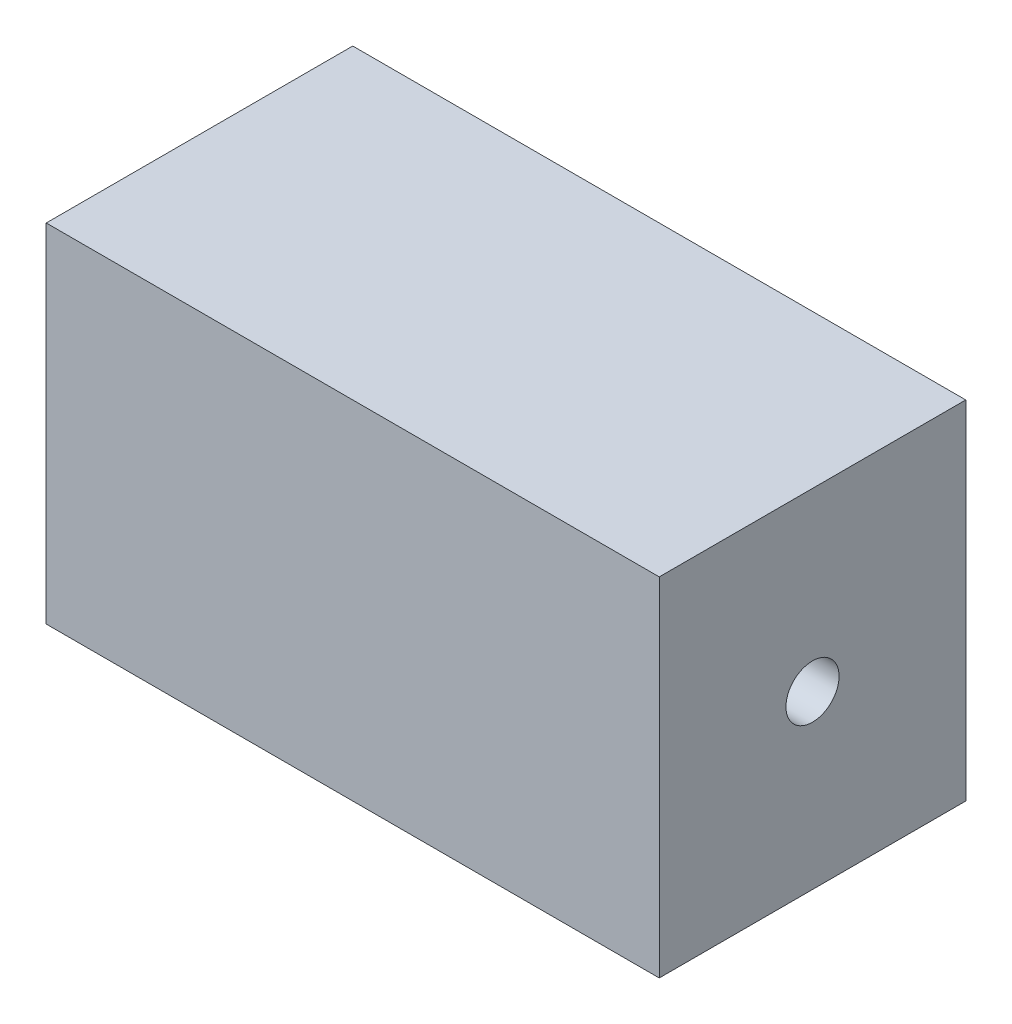
ISO-10303-21;
HEADER;
FILE_DESCRIPTION(('STEP AP214'),'2;1');
FILE_NAME('part.step','',(''),(''),'','','');
FILE_SCHEMA(('AUTOMOTIVE_DESIGN { 1 0 10303 214 1 1 1 1 }'));
ENDSEC;
DATA;
#1=APPLICATION_CONTEXT('core data for automotive mechanical design processes');
#2=APPLICATION_PROTOCOL_DEFINITION('international standard','automotive_design',2000,#1);
#3=PRODUCT_CONTEXT('',#1,'mechanical');
#4=PRODUCT('Part','Part','',(#3));
#5=PRODUCT_RELATED_PRODUCT_CATEGORY('part','',(#4));
#6=PRODUCT_DEFINITION_FORMATION('','',#4);
#7=PRODUCT_DEFINITION_CONTEXT('part definition',#1,'design');
#8=PRODUCT_DEFINITION('design','',#6,#7);
#9=PRODUCT_DEFINITION_SHAPE('','',#8);
#10=(LENGTH_UNIT() NAMED_UNIT(*) SI_UNIT(.MILLI.,.METRE.));
#11=(NAMED_UNIT(*) PLANE_ANGLE_UNIT() SI_UNIT($,.RADIAN.));
#12=(NAMED_UNIT(*) SI_UNIT($,.STERADIAN.) SOLID_ANGLE_UNIT());
#13=UNCERTAINTY_MEASURE_WITH_UNIT(LENGTH_MEASURE(1.E-05),#10,'distance_accuracy_value','');
#14=(GEOMETRIC_REPRESENTATION_CONTEXT(3) GLOBAL_UNCERTAINTY_ASSIGNED_CONTEXT((#13)) GLOBAL_UNIT_ASSIGNED_CONTEXT((#10,
#11,#12)) REPRESENTATION_CONTEXT('',''));
#15=CARTESIAN_POINT('',(0.,0.,0.));
#16=DIRECTION('',(0.,0.,1.));
#17=DIRECTION('',(1.,0.,0.));
#18=AXIS2_PLACEMENT_3D('',#15,#16,#17);
#19=CARTESIAN_POINT('',(0.,107.95,-95.25));
#20=DIRECTION('',(0.,0.,-1.));
#21=DIRECTION('',(-1.,0.,0.));
#22=AXIS2_PLACEMENT_3D('',#19,#20,#21);
#23=PLANE('',#22);
#24=DIRECTION('',(1.,0.,0.));
#25=VECTOR('',#24,1.);
#26=CARTESIAN_POINT('',(0.,0.,-95.25));
#27=LINE('',#26,#25);
#28=CARTESIAN_POINT('',(0.,0.,-95.25));
#29=VERTEX_POINT('',#28);
#30=CARTESIAN_POINT('',(190.5,0.,-95.25));
#31=VERTEX_POINT('',#30);
#32=EDGE_CURVE('E102',#29,#31,#27,.T.);
#33=ORIENTED_EDGE('',*,*,#32,.F.);
#34=DIRECTION('',(0.,-1.,0.));
#35=VECTOR('',#34,1.);
#36=CARTESIAN_POINT('',(0.,107.95,-95.25));
#37=LINE('',#36,#35);
#38=CARTESIAN_POINT('',(0.,107.95,-95.25));
#39=VERTEX_POINT('',#38);
#40=EDGE_CURVE('E11',#39,#29,#37,.T.);
#41=ORIENTED_EDGE('',*,*,#40,.F.);
#42=DIRECTION('',(1.,0.,0.));
#43=VECTOR('',#42,1.);
#44=CARTESIAN_POINT('',(0.,107.95,-95.25));
#45=LINE('',#44,#43);
#46=CARTESIAN_POINT('',(190.5,107.95,-95.25));
#47=VERTEX_POINT('',#46);
#48=EDGE_CURVE('E95',#39,#47,#45,.T.);
#49=ORIENTED_EDGE('',*,*,#48,.T.);
#50=DIRECTION('',(0.,-1.,0.));
#51=VECTOR('',#50,1.);
#52=CARTESIAN_POINT('',(190.5,107.95,-95.25));
#53=LINE('',#52,#51);
#54=EDGE_CURVE('E92',#47,#31,#53,.T.);
#55=ORIENTED_EDGE('',*,*,#54,.T.);
#56=EDGE_LOOP('',(#33,#41,#49,#55));
#57=FACE_BOUND('',#56,.T.);
#58=ADVANCED_FACE('F35',(#57),#23,.T.);
#59=CARTESIAN_POINT('',(0.,107.95,0.));
#60=DIRECTION('',(-1.,0.,0.));
#61=DIRECTION('',(0.,0.,1.));
#62=AXIS2_PLACEMENT_3D('',#59,#60,#61);
#63=PLANE('',#62);
#64=DIRECTION('',(0.,0.,-1.));
#65=VECTOR('',#64,1.);
#66=CARTESIAN_POINT('',(0.,0.,0.));
#67=LINE('',#66,#65);
#68=CARTESIAN_POINT('',(0.,0.,0.));
#69=VERTEX_POINT('',#68);
#70=EDGE_CURVE('E97',#69,#29,#67,.T.);
#71=ORIENTED_EDGE('',*,*,#70,.F.);
#72=DIRECTION('',(0.,-1.,0.));
#73=VECTOR('',#72,1.);
#74=CARTESIAN_POINT('',(0.,107.95,0.));
#75=LINE('',#74,#73);
#76=CARTESIAN_POINT('',(0.,107.95,0.));
#77=VERTEX_POINT('',#76);
#78=EDGE_CURVE('E44',#77,#69,#75,.T.);
#79=ORIENTED_EDGE('',*,*,#78,.F.);
#80=DIRECTION('',(0.,0.,-1.));
#81=VECTOR('',#80,1.);
#82=CARTESIAN_POINT('',(0.,107.95,0.));
#83=LINE('',#82,#81);
#84=EDGE_CURVE('E83',#77,#39,#83,.T.);
#85=ORIENTED_EDGE('',*,*,#84,.T.);
#86=ORIENTED_EDGE('',*,*,#40,.T.);
#87=EDGE_LOOP('',(#71,#79,#85,#86));
#88=FACE_BOUND('',#87,.T.);
#89=ADVANCED_FACE('F112',(#88),#63,.T.);
#90=CARTESIAN_POINT('',(0.,107.95,0.));
#91=DIRECTION('',(0.,0.,-1.));
#92=DIRECTION('',(-1.,0.,0.));
#93=AXIS2_PLACEMENT_3D('',#90,#91,#92);
#94=PLANE('',#93);
#95=DIRECTION('',(1.,0.,0.));
#96=VECTOR('',#95,1.);
#97=CARTESIAN_POINT('',(0.,0.,0.));
#98=LINE('',#97,#96);
#99=CARTESIAN_POINT('',(190.5,0.,0.));
#100=VERTEX_POINT('',#99);
#101=EDGE_CURVE('E88',#69,#100,#98,.T.);
#102=ORIENTED_EDGE('',*,*,#101,.T.);
#103=DIRECTION('',(0.,-1.,0.));
#104=VECTOR('',#103,1.);
#105=CARTESIAN_POINT('',(190.5,107.95,0.));
#106=LINE('',#105,#104);
#107=CARTESIAN_POINT('',(190.5,107.95,0.));
#108=VERTEX_POINT('',#107);
#109=EDGE_CURVE('E86',#108,#100,#106,.T.);
#110=ORIENTED_EDGE('',*,*,#109,.F.);
#111=DIRECTION('',(1.,0.,0.));
#112=VECTOR('',#111,1.);
#113=CARTESIAN_POINT('',(0.,107.95,0.));
#114=LINE('',#113,#112);
#115=EDGE_CURVE('E80',#77,#108,#114,.T.);
#116=ORIENTED_EDGE('',*,*,#115,.F.);
#117=ORIENTED_EDGE('',*,*,#78,.T.);
#118=EDGE_LOOP('',(#102,#110,#116,#117));
#119=FACE_BOUND('',#118,.T.);
#120=ADVANCED_FACE('F87',(#119),#94,.F.);
#121=CARTESIAN_POINT('',(190.5,107.95,0.));
#122=DIRECTION('',(-1.,0.,0.));
#123=DIRECTION('',(0.,0.,1.));
#124=AXIS2_PLACEMENT_3D('',#121,#122,#123);
#125=PLANE('',#124);
#126=CARTESIAN_POINT('',(190.5,53.2868719153612,-47.625));
#127=DIRECTION('',(-1.,0.,0.));
#128=DIRECTION('',(0.,0.,1.));
#129=AXIS2_PLACEMENT_3D('',#126,#127,#128);
#130=CIRCLE('',#129,8.255);
#131=CARTESIAN_POINT('',(190.5,53.2868719153612,-39.37));
#132=VERTEX_POINT('',#131);
#133=EDGE_CURVE('E38',#132,#132,#130,.T.);
#134=ORIENTED_EDGE('',*,*,#133,.T.);
#135=EDGE_LOOP('',(#134));
#136=FACE_BOUND('',#135,.T.);
#137=DIRECTION('',(0.,0.,-1.));
#138=VECTOR('',#137,1.);
#139=CARTESIAN_POINT('',(190.5,0.,0.));
#140=LINE('',#139,#138);
#141=EDGE_CURVE('E105',#100,#31,#140,.T.);
#142=ORIENTED_EDGE('',*,*,#141,.T.);
#143=ORIENTED_EDGE('',*,*,#54,.F.);
#144=DIRECTION('',(0.,0.,-1.));
#145=VECTOR('',#144,1.);
#146=CARTESIAN_POINT('',(190.5,107.95,0.));
#147=LINE('',#146,#145);
#148=EDGE_CURVE('E77',#108,#47,#147,.T.);
#149=ORIENTED_EDGE('',*,*,#148,.F.);
#150=ORIENTED_EDGE('',*,*,#109,.T.);
#151=EDGE_LOOP('',(#142,#143,#149,#150));
#152=FACE_BOUND('',#151,.T.);
#153=ADVANCED_FACE('F94',(#136,#152),#125,.F.);
#154=CARTESIAN_POINT('',(0.,107.95,0.));
#155=DIRECTION('',(0.,1.,0.));
#156=DIRECTION('',(0.,0.,1.));
#157=AXIS2_PLACEMENT_3D('',#154,#155,#156);
#158=PLANE('',#157);
#159=ORIENTED_EDGE('',*,*,#48,.F.);
#160=ORIENTED_EDGE('',*,*,#84,.F.);
#161=ORIENTED_EDGE('',*,*,#115,.T.);
#162=ORIENTED_EDGE('',*,*,#148,.T.);
#163=EDGE_LOOP('',(#159,#160,#161,#162));
#164=FACE_BOUND('',#163,.T.);
#165=ADVANCED_FACE('F82',(#164),#158,.T.);
#166=CARTESIAN_POINT('',(0.,0.,0.));
#167=DIRECTION('',(0.,1.,0.));
#168=DIRECTION('',(0.,0.,1.));
#169=AXIS2_PLACEMENT_3D('',#166,#167,#168);
#170=PLANE('',#169);
#171=ORIENTED_EDGE('',*,*,#32,.T.);
#172=ORIENTED_EDGE('',*,*,#141,.F.);
#173=ORIENTED_EDGE('',*,*,#101,.F.);
#174=ORIENTED_EDGE('',*,*,#70,.T.);
#175=EDGE_LOOP('',(#171,#172,#173,#174));
#176=FACE_BOUND('',#175,.T.);
#177=ADVANCED_FACE('F111',(#176),#170,.F.);
#178=CARTESIAN_POINT('',(157.353,53.2868719153612,-47.625));
#179=DIRECTION('',(1.,0.,0.));
#180=DIRECTION('',(0.,0.,-1.));
#181=AXIS2_PLACEMENT_3D('',#178,#179,#180);
#182=CYLINDRICAL_SURFACE('',#181,8.255);
#183=CARTESIAN_POINT('',(157.353,53.2868719153612,-47.625));
#184=DIRECTION('',(1.,0.,0.));
#185=DIRECTION('',(0.,0.,-1.));
#186=AXIS2_PLACEMENT_3D('',#183,#184,#185);
#187=CIRCLE('',#186,8.255);
#188=CARTESIAN_POINT('',(157.353,53.2868719153612,-55.88));
#189=VERTEX_POINT('',#188);
#190=EDGE_CURVE('E130',#189,#189,#187,.T.);
#191=ORIENTED_EDGE('',*,*,#190,.F.);
#192=EDGE_LOOP('',(#191));
#193=FACE_BOUND('',#192,.T.);
#194=ORIENTED_EDGE('',*,*,#133,.F.);
#195=EDGE_LOOP('',(#194));
#196=FACE_BOUND('',#195,.T.);
#197=ADVANCED_FACE('F136',(#193,#196),#182,.F.);
#198=CARTESIAN_POINT('',(157.353,53.2868719153612,-47.625));
#199=DIRECTION('',(1.,0.,0.));
#200=DIRECTION('',(0.,0.,-1.));
#201=AXIS2_PLACEMENT_3D('',#198,#199,#200);
#202=PLANE('',#201);
#203=ORIENTED_EDGE('',*,*,#190,.T.);
#204=EDGE_LOOP('',(#203));
#205=FACE_BOUND('',#204,.T.);
#206=ADVANCED_FACE('F134',(#205),#202,.T.);
#207=CLOSED_SHELL('',(#58,#89,#120,#153,#165,#177,#197,#206));
#208=MANIFOLD_SOLID_BREP('B2',#207);
#209=ADVANCED_BREP_SHAPE_REPRESENTATION('',(#18,#208),#14);
#210=SHAPE_DEFINITION_REPRESENTATION(#9,#209);
ENDSEC;
END-ISO-10303-21;
